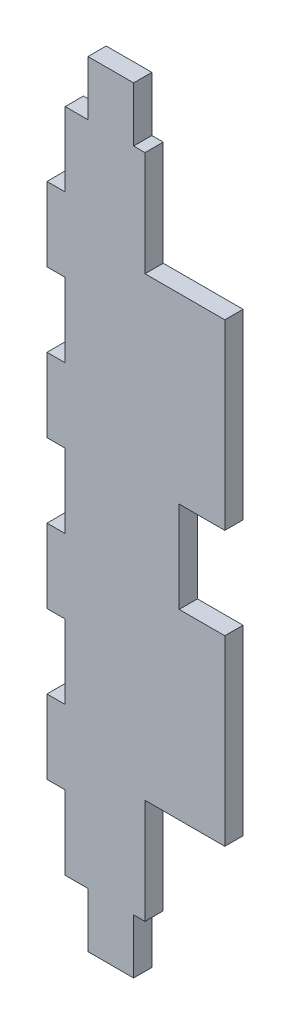
ISO-10303-21;
HEADER;
FILE_DESCRIPTION(('STEP AP214'),'2;1');
FILE_NAME('part.step','',(''),(''),'','','');
FILE_SCHEMA(('AUTOMOTIVE_DESIGN { 1 0 10303 214 1 1 1 1 }'));
ENDSEC;
DATA;
#1=APPLICATION_CONTEXT('core data for automotive mechanical design processes');
#2=APPLICATION_PROTOCOL_DEFINITION('international standard','automotive_design',2000,#1);
#3=PRODUCT_CONTEXT('',#1,'mechanical');
#4=PRODUCT('Part','Part','',(#3));
#5=PRODUCT_RELATED_PRODUCT_CATEGORY('part','',(#4));
#6=PRODUCT_DEFINITION_FORMATION('','',#4);
#7=PRODUCT_DEFINITION_CONTEXT('part definition',#1,'design');
#8=PRODUCT_DEFINITION('design','',#6,#7);
#9=PRODUCT_DEFINITION_SHAPE('','',#8);
#10=(LENGTH_UNIT() NAMED_UNIT(*) SI_UNIT(.MILLI.,.METRE.));
#11=(NAMED_UNIT(*) PLANE_ANGLE_UNIT() SI_UNIT($,.RADIAN.));
#12=(NAMED_UNIT(*) SI_UNIT($,.STERADIAN.) SOLID_ANGLE_UNIT());
#13=UNCERTAINTY_MEASURE_WITH_UNIT(LENGTH_MEASURE(1.E-05),#10,'distance_accuracy_value','');
#14=(GEOMETRIC_REPRESENTATION_CONTEXT(3) GLOBAL_UNCERTAINTY_ASSIGNED_CONTEXT((#13)) GLOBAL_UNIT_ASSIGNED_CONTEXT((#10,
#11,#12)) REPRESENTATION_CONTEXT('',''));
#15=CARTESIAN_POINT('',(0.,0.,0.));
#16=DIRECTION('',(0.,0.,1.));
#17=DIRECTION('',(1.,0.,0.));
#18=AXIS2_PLACEMENT_3D('',#15,#16,#17);
#19=CARTESIAN_POINT('',(44.45,-156.21,5.08));
#20=DIRECTION('',(-1.,0.,0.));
#21=DIRECTION('',(0.,0.,1.));
#22=AXIS2_PLACEMENT_3D('',#19,#20,#21);
#23=PLANE('',#22);
#24=DIRECTION('',(0.,0.,1.));
#25=VECTOR('',#24,1.);
#26=CARTESIAN_POINT('',(44.45,-80.01,5.08));
#27=LINE('',#26,#25);
#28=CARTESIAN_POINT('',(44.45,-80.01,0.));
#29=VERTEX_POINT('',#28);
#30=CARTESIAN_POINT('',(44.45,-80.01,5.08));
#31=VERTEX_POINT('',#30);
#32=EDGE_CURVE('E650',#29,#31,#27,.T.);
#33=ORIENTED_EDGE('',*,*,#32,.F.);
#34=DIRECTION('',(0.,1.,0.));
#35=VECTOR('',#34,1.);
#36=CARTESIAN_POINT('',(44.45,-156.21,0.));
#37=LINE('',#36,#35);
#38=CARTESIAN_POINT('',(44.45,-29.21,0.));
#39=VERTEX_POINT('',#38);
#40=EDGE_CURVE('E380',#29,#39,#37,.T.);
#41=ORIENTED_EDGE('',*,*,#40,.T.);
#42=DIRECTION('',(0.,0.,-1.));
#43=VECTOR('',#42,1.);
#44=CARTESIAN_POINT('',(44.45,-29.21,5.08));
#45=LINE('',#44,#43);
#46=CARTESIAN_POINT('',(44.45,-29.21,5.08));
#47=VERTEX_POINT('',#46);
#48=EDGE_CURVE('E416',#47,#39,#45,.T.);
#49=ORIENTED_EDGE('',*,*,#48,.F.);
#50=DIRECTION('',(0.,1.,0.));
#51=VECTOR('',#50,1.);
#52=CARTESIAN_POINT('',(44.45,-156.21,5.08));
#53=LINE('',#52,#51);
#54=EDGE_CURVE('E603',#31,#47,#53,.T.);
#55=ORIENTED_EDGE('',*,*,#54,.F.);
#56=EDGE_LOOP('',(#33,#41,#49,#55));
#57=FACE_BOUND('',#56,.T.);
#58=ADVANCED_FACE('F45',(#57),#23,.F.);
#59=CARTESIAN_POINT('',(6.34999999999998,0.,5.08));
#60=DIRECTION('',(0.,-1.,0.));
#61=DIRECTION('',(1.,0.,0.));
#62=AXIS2_PLACEMENT_3D('',#59,#60,#61);
#63=PLANE('',#62);
#64=DIRECTION('',(-1.,0.,0.));
#65=VECTOR('',#64,1.);
#66=CARTESIAN_POINT('',(6.34999999999998,0.,0.));
#67=LINE('',#66,#65);
#68=CARTESIAN_POINT('',(6.34999999999998,0.,0.));
#69=VERTEX_POINT('',#68);
#70=CARTESIAN_POINT('',(0.,0.,0.));
#71=VERTEX_POINT('',#70);
#72=EDGE_CURVE('E303',#69,#71,#67,.T.);
#73=ORIENTED_EDGE('',*,*,#72,.T.);
#74=DIRECTION('',(0.,0.,-1.));
#75=VECTOR('',#74,1.);
#76=CARTESIAN_POINT('',(0.,0.,5.08));
#77=LINE('',#76,#75);
#78=CARTESIAN_POINT('',(0.,0.,5.08));
#79=VERTEX_POINT('',#78);
#80=EDGE_CURVE('E11',#79,#71,#77,.T.);
#81=ORIENTED_EDGE('',*,*,#80,.F.);
#82=DIRECTION('',(-1.,0.,0.));
#83=VECTOR('',#82,1.);
#84=CARTESIAN_POINT('',(6.34999999999998,0.,5.08));
#85=LINE('',#84,#83);
#86=CARTESIAN_POINT('',(6.34999999999998,0.,5.08));
#87=VERTEX_POINT('',#86);
#88=EDGE_CURVE('E401',#87,#79,#85,.T.);
#89=ORIENTED_EDGE('',*,*,#88,.F.);
#90=DIRECTION('',(0.,0.,-1.));
#91=VECTOR('',#90,1.);
#92=CARTESIAN_POINT('',(6.34999999999998,0.,5.08));
#93=LINE('',#92,#91);
#94=EDGE_CURVE('E299',#87,#69,#93,.T.);
#95=ORIENTED_EDGE('',*,*,#94,.T.);
#96=EDGE_LOOP('',(#73,#81,#89,#95));
#97=FACE_BOUND('',#96,.T.);
#98=ADVANCED_FACE('F47',(#97),#63,.F.);
#99=CARTESIAN_POINT('',(0.,0.,5.08));
#100=DIRECTION('',(1.,0.,0.));
#101=DIRECTION('',(0.,0.,-1.));
#102=AXIS2_PLACEMENT_3D('',#99,#100,#101);
#103=PLANE('',#102);
#104=DIRECTION('',(0.,-1.,0.));
#105=VECTOR('',#104,1.);
#106=CARTESIAN_POINT('',(0.,0.,0.));
#107=LINE('',#106,#105);
#108=CARTESIAN_POINT('',(0.,-20.6022222222222,0.));
#109=VERTEX_POINT('',#108);
#110=EDGE_CURVE('E307',#71,#109,#107,.T.);
#111=ORIENTED_EDGE('',*,*,#110,.T.);
#112=DIRECTION('',(0.,0.,-1.));
#113=VECTOR('',#112,1.);
#114=CARTESIAN_POINT('',(0.,-20.6022222222222,5.08));
#115=LINE('',#114,#113);
#116=CARTESIAN_POINT('',(0.,-20.6022222222222,5.08));
#117=VERTEX_POINT('',#116);
#118=EDGE_CURVE('E54',#117,#109,#115,.T.);
#119=ORIENTED_EDGE('',*,*,#118,.F.);
#120=DIRECTION('',(0.,-1.,0.));
#121=VECTOR('',#120,1.);
#122=CARTESIAN_POINT('',(0.,0.,5.08));
#123=LINE('',#122,#121);
#124=EDGE_CURVE('E183',#79,#117,#123,.T.);
#125=ORIENTED_EDGE('',*,*,#124,.F.);
#126=ORIENTED_EDGE('',*,*,#80,.T.);
#127=EDGE_LOOP('',(#111,#119,#125,#126));
#128=FACE_BOUND('',#127,.T.);
#129=ADVANCED_FACE('F816',(#128),#103,.F.);
#130=CARTESIAN_POINT('',(0.,-20.6022222222222,5.08));
#131=DIRECTION('',(0.,-1.,0.));
#132=DIRECTION('',(1.,0.,0.));
#133=AXIS2_PLACEMENT_3D('',#130,#131,#132);
#134=PLANE('',#133);
#135=DIRECTION('',(-1.,0.,0.));
#136=VECTOR('',#135,1.);
#137=CARTESIAN_POINT('',(0.,-20.6022222222222,0.));
#138=LINE('',#137,#136);
#139=CARTESIAN_POINT('',(-5.08,-20.6022222222222,0.));
#140=VERTEX_POINT('',#139);
#141=EDGE_CURVE('E311',#109,#140,#138,.T.);
#142=ORIENTED_EDGE('',*,*,#141,.T.);
#143=DIRECTION('',(0.,0.,-1.));
#144=VECTOR('',#143,1.);
#145=CARTESIAN_POINT('',(-5.08,-20.6022222222222,5.08));
#146=LINE('',#145,#144);
#147=CARTESIAN_POINT('',(-5.08,-20.6022222222222,5.08));
#148=VERTEX_POINT('',#147);
#149=EDGE_CURVE('E508',#148,#140,#146,.T.);
#150=ORIENTED_EDGE('',*,*,#149,.F.);
#151=DIRECTION('',(-1.,0.,0.));
#152=VECTOR('',#151,1.);
#153=CARTESIAN_POINT('',(0.,-20.6022222222222,5.08));
#154=LINE('',#153,#152);
#155=EDGE_CURVE('E518',#117,#148,#154,.T.);
#156=ORIENTED_EDGE('',*,*,#155,.F.);
#157=ORIENTED_EDGE('',*,*,#118,.T.);
#158=EDGE_LOOP('',(#142,#150,#156,#157));
#159=FACE_BOUND('',#158,.T.);
#160=ADVANCED_FACE('F516',(#159),#134,.F.);
#161=CARTESIAN_POINT('',(-5.08,-20.6022222222222,5.08));
#162=DIRECTION('',(1.,0.,0.));
#163=DIRECTION('',(0.,0.,-1.));
#164=AXIS2_PLACEMENT_3D('',#161,#162,#163);
#165=PLANE('',#164);
#166=DIRECTION('',(0.,-1.,0.));
#167=VECTOR('',#166,1.);
#168=CARTESIAN_POINT('',(-5.08,-20.6022222222222,0.));
#169=LINE('',#168,#167);
#170=CARTESIAN_POINT('',(-5.08,-41.2044444444444,0.));
#171=VERTEX_POINT('',#170);
#172=EDGE_CURVE('E314',#140,#171,#169,.T.);
#173=ORIENTED_EDGE('',*,*,#172,.T.);
#174=DIRECTION('',(0.,0.,-1.));
#175=VECTOR('',#174,1.);
#176=CARTESIAN_POINT('',(-5.08,-41.2044444444444,5.08));
#177=LINE('',#176,#175);
#178=CARTESIAN_POINT('',(-5.08,-41.2044444444444,5.08));
#179=VERTEX_POINT('',#178);
#180=EDGE_CURVE('E504',#179,#171,#177,.T.);
#181=ORIENTED_EDGE('',*,*,#180,.F.);
#182=DIRECTION('',(0.,-1.,0.));
#183=VECTOR('',#182,1.);
#184=CARTESIAN_POINT('',(-5.08,-20.6022222222222,5.08));
#185=LINE('',#184,#183);
#186=EDGE_CURVE('E538',#148,#179,#185,.T.);
#187=ORIENTED_EDGE('',*,*,#186,.F.);
#188=ORIENTED_EDGE('',*,*,#149,.T.);
#189=EDGE_LOOP('',(#173,#181,#187,#188));
#190=FACE_BOUND('',#189,.T.);
#191=ADVANCED_FACE('F528',(#190),#165,.F.);
#192=CARTESIAN_POINT('',(-5.08,-41.2044444444444,5.08));
#193=DIRECTION('',(0.,1.,0.));
#194=DIRECTION('',(-1.,0.,0.));
#195=AXIS2_PLACEMENT_3D('',#192,#193,#194);
#196=PLANE('',#195);
#197=DIRECTION('',(1.,0.,0.));
#198=VECTOR('',#197,1.);
#199=CARTESIAN_POINT('',(-5.08,-41.2044444444444,0.));
#200=LINE('',#199,#198);
#201=CARTESIAN_POINT('',(0.,-41.2044444444445,0.));
#202=VERTEX_POINT('',#201);
#203=EDGE_CURVE('E317',#171,#202,#200,.T.);
#204=ORIENTED_EDGE('',*,*,#203,.T.);
#205=DIRECTION('',(0.,0.,-1.));
#206=VECTOR('',#205,1.);
#207=CARTESIAN_POINT('',(0.,-41.2044444444445,5.08));
#208=LINE('',#207,#206);
#209=CARTESIAN_POINT('',(0.,-41.2044444444445,5.08));
#210=VERTEX_POINT('',#209);
#211=EDGE_CURVE('E500',#210,#202,#208,.T.);
#212=ORIENTED_EDGE('',*,*,#211,.F.);
#213=DIRECTION('',(1.,0.,0.));
#214=VECTOR('',#213,1.);
#215=CARTESIAN_POINT('',(-5.08,-41.2044444444444,5.08));
#216=LINE('',#215,#214);
#217=EDGE_CURVE('E534',#179,#210,#216,.T.);
#218=ORIENTED_EDGE('',*,*,#217,.F.);
#219=ORIENTED_EDGE('',*,*,#180,.T.);
#220=EDGE_LOOP('',(#204,#212,#218,#219));
#221=FACE_BOUND('',#220,.T.);
#222=ADVANCED_FACE('F532',(#221),#196,.F.);
#223=CARTESIAN_POINT('',(0.,-41.2044444444445,5.08));
#224=DIRECTION('',(1.,0.,0.));
#225=DIRECTION('',(0.,0.,-1.));
#226=AXIS2_PLACEMENT_3D('',#223,#224,#225);
#227=PLANE('',#226);
#228=DIRECTION('',(0.,-1.,0.));
#229=VECTOR('',#228,1.);
#230=CARTESIAN_POINT('',(0.,-41.2044444444445,0.));
#231=LINE('',#230,#229);
#232=CARTESIAN_POINT('',(0.,-61.8066666666667,0.));
#233=VERTEX_POINT('',#232);
#234=EDGE_CURVE('E320',#202,#233,#231,.T.);
#235=ORIENTED_EDGE('',*,*,#234,.T.);
#236=DIRECTION('',(0.,0.,-1.));
#237=VECTOR('',#236,1.);
#238=CARTESIAN_POINT('',(0.,-61.8066666666667,5.08));
#239=LINE('',#238,#237);
#240=CARTESIAN_POINT('',(0.,-61.8066666666667,5.08));
#241=VERTEX_POINT('',#240);
#242=EDGE_CURVE('E496',#241,#233,#239,.T.);
#243=ORIENTED_EDGE('',*,*,#242,.F.);
#244=DIRECTION('',(0.,-1.,0.));
#245=VECTOR('',#244,1.);
#246=CARTESIAN_POINT('',(0.,-41.2044444444445,5.08));
#247=LINE('',#246,#245);
#248=EDGE_CURVE('E537',#210,#241,#247,.T.);
#249=ORIENTED_EDGE('',*,*,#248,.F.);
#250=ORIENTED_EDGE('',*,*,#211,.T.);
#251=EDGE_LOOP('',(#235,#243,#249,#250));
#252=FACE_BOUND('',#251,.T.);
#253=ADVANCED_FACE('F785',(#252),#227,.F.);
#254=CARTESIAN_POINT('',(0.,-61.8066666666667,5.08));
#255=DIRECTION('',(0.,-1.,0.));
#256=DIRECTION('',(1.,0.,0.));
#257=AXIS2_PLACEMENT_3D('',#254,#255,#256);
#258=PLANE('',#257);
#259=DIRECTION('',(-1.,0.,0.));
#260=VECTOR('',#259,1.);
#261=CARTESIAN_POINT('',(0.,-61.8066666666667,0.));
#262=LINE('',#261,#260);
#263=CARTESIAN_POINT('',(-5.08,-61.8066666666667,0.));
#264=VERTEX_POINT('',#263);
#265=EDGE_CURVE('E323',#233,#264,#262,.T.);
#266=ORIENTED_EDGE('',*,*,#265,.T.);
#267=DIRECTION('',(0.,0.,-1.));
#268=VECTOR('',#267,1.);
#269=CARTESIAN_POINT('',(-5.08,-61.8066666666667,5.08));
#270=LINE('',#269,#268);
#271=CARTESIAN_POINT('',(-5.08,-61.8066666666667,5.08));
#272=VERTEX_POINT('',#271);
#273=EDGE_CURVE('E492',#272,#264,#270,.T.);
#274=ORIENTED_EDGE('',*,*,#273,.F.);
#275=DIRECTION('',(-1.,0.,0.));
#276=VECTOR('',#275,1.);
#277=CARTESIAN_POINT('',(0.,-61.8066666666667,5.08));
#278=LINE('',#277,#276);
#279=EDGE_CURVE('E542',#241,#272,#278,.T.);
#280=ORIENTED_EDGE('',*,*,#279,.F.);
#281=ORIENTED_EDGE('',*,*,#242,.T.);
#282=EDGE_LOOP('',(#266,#274,#280,#281));
#283=FACE_BOUND('',#282,.T.);
#284=ADVANCED_FACE('F782',(#283),#258,.F.);
#285=CARTESIAN_POINT('',(-5.08,-61.8066666666667,5.08));
#286=DIRECTION('',(1.,0.,0.));
#287=DIRECTION('',(0.,0.,-1.));
#288=AXIS2_PLACEMENT_3D('',#285,#286,#287);
#289=PLANE('',#288);
#290=DIRECTION('',(0.,-1.,0.));
#291=VECTOR('',#290,1.);
#292=CARTESIAN_POINT('',(-5.08,-61.8066666666667,0.));
#293=LINE('',#292,#291);
#294=CARTESIAN_POINT('',(-5.08,-82.4088888888889,0.));
#295=VERTEX_POINT('',#294);
#296=EDGE_CURVE('E326',#264,#295,#293,.T.);
#297=ORIENTED_EDGE('',*,*,#296,.T.);
#298=DIRECTION('',(0.,0.,-1.));
#299=VECTOR('',#298,1.);
#300=CARTESIAN_POINT('',(-5.08,-82.4088888888889,5.08));
#301=LINE('',#300,#299);
#302=CARTESIAN_POINT('',(-5.08,-82.4088888888889,5.08));
#303=VERTEX_POINT('',#302);
#304=EDGE_CURVE('E488',#303,#295,#301,.T.);
#305=ORIENTED_EDGE('',*,*,#304,.F.);
#306=DIRECTION('',(0.,-1.,0.));
#307=VECTOR('',#306,1.);
#308=CARTESIAN_POINT('',(-5.08,-61.8066666666667,5.08));
#309=LINE('',#308,#307);
#310=EDGE_CURVE('E549',#272,#303,#309,.T.);
#311=ORIENTED_EDGE('',*,*,#310,.F.);
#312=ORIENTED_EDGE('',*,*,#273,.T.);
#313=EDGE_LOOP('',(#297,#305,#311,#312));
#314=FACE_BOUND('',#313,.T.);
#315=ADVANCED_FACE('F778',(#314),#289,.F.);
#316=CARTESIAN_POINT('',(-5.08,-82.4088888888889,5.08));
#317=DIRECTION('',(0.,1.,0.));
#318=DIRECTION('',(-1.,0.,0.));
#319=AXIS2_PLACEMENT_3D('',#316,#317,#318);
#320=PLANE('',#319);
#321=DIRECTION('',(1.,0.,0.));
#322=VECTOR('',#321,1.);
#323=CARTESIAN_POINT('',(-5.08,-82.4088888888889,0.));
#324=LINE('',#323,#322);
#325=CARTESIAN_POINT('',(0.,-82.4088888888889,0.));
#326=VERTEX_POINT('',#325);
#327=EDGE_CURVE('E329',#295,#326,#324,.T.);
#328=ORIENTED_EDGE('',*,*,#327,.T.);
#329=DIRECTION('',(0.,0.,-1.));
#330=VECTOR('',#329,1.);
#331=CARTESIAN_POINT('',(0.,-82.4088888888889,5.08));
#332=LINE('',#331,#330);
#333=CARTESIAN_POINT('',(0.,-82.4088888888889,5.08));
#334=VERTEX_POINT('',#333);
#335=EDGE_CURVE('E484',#334,#326,#332,.T.);
#336=ORIENTED_EDGE('',*,*,#335,.F.);
#337=DIRECTION('',(1.,0.,0.));
#338=VECTOR('',#337,1.);
#339=CARTESIAN_POINT('',(-5.08,-82.4088888888889,5.08));
#340=LINE('',#339,#338);
#341=EDGE_CURVE('E552',#303,#334,#340,.T.);
#342=ORIENTED_EDGE('',*,*,#341,.F.);
#343=ORIENTED_EDGE('',*,*,#304,.T.);
#344=EDGE_LOOP('',(#328,#336,#342,#343));
#345=FACE_BOUND('',#344,.T.);
#346=ADVANCED_FACE('F773',(#345),#320,.F.);
#347=CARTESIAN_POINT('',(0.,-82.4088888888889,5.08));
#348=DIRECTION('',(1.,0.,0.));
#349=DIRECTION('',(0.,0.,-1.));
#350=AXIS2_PLACEMENT_3D('',#347,#348,#349);
#351=PLANE('',#350);
#352=DIRECTION('',(0.,-1.,0.));
#353=VECTOR('',#352,1.);
#354=CARTESIAN_POINT('',(0.,-82.4088888888889,0.));
#355=LINE('',#354,#353);
#356=CARTESIAN_POINT('',(0.,-103.011111111111,0.));
#357=VERTEX_POINT('',#356);
#358=EDGE_CURVE('E332',#326,#357,#355,.T.);
#359=ORIENTED_EDGE('',*,*,#358,.T.);
#360=DIRECTION('',(0.,0.,-1.));
#361=VECTOR('',#360,1.);
#362=CARTESIAN_POINT('',(0.,-103.011111111111,5.08));
#363=LINE('',#362,#361);
#364=CARTESIAN_POINT('',(0.,-103.011111111111,5.08));
#365=VERTEX_POINT('',#364);
#366=EDGE_CURVE('E480',#365,#357,#363,.T.);
#367=ORIENTED_EDGE('',*,*,#366,.F.);
#368=DIRECTION('',(0.,-1.,0.));
#369=VECTOR('',#368,1.);
#370=CARTESIAN_POINT('',(0.,-82.4088888888889,5.08));
#371=LINE('',#370,#369);
#372=EDGE_CURVE('E555',#334,#365,#371,.T.);
#373=ORIENTED_EDGE('',*,*,#372,.F.);
#374=ORIENTED_EDGE('',*,*,#335,.T.);
#375=EDGE_LOOP('',(#359,#367,#373,#374));
#376=FACE_BOUND('',#375,.T.);
#377=ADVANCED_FACE('F767',(#376),#351,.F.);
#378=CARTESIAN_POINT('',(0.,-103.011111111111,5.08));
#379=DIRECTION('',(0.,-1.,0.));
#380=DIRECTION('',(1.,0.,0.));
#381=AXIS2_PLACEMENT_3D('',#378,#379,#380);
#382=PLANE('',#381);
#383=DIRECTION('',(-1.,0.,0.));
#384=VECTOR('',#383,1.);
#385=CARTESIAN_POINT('',(0.,-103.011111111111,0.));
#386=LINE('',#385,#384);
#387=CARTESIAN_POINT('',(-5.08,-103.011111111111,0.));
#388=VERTEX_POINT('',#387);
#389=EDGE_CURVE('E335',#357,#388,#386,.T.);
#390=ORIENTED_EDGE('',*,*,#389,.T.);
#391=DIRECTION('',(0.,0.,-1.));
#392=VECTOR('',#391,1.);
#393=CARTESIAN_POINT('',(-5.08,-103.011111111111,5.08));
#394=LINE('',#393,#392);
#395=CARTESIAN_POINT('',(-5.08,-103.011111111111,5.08));
#396=VERTEX_POINT('',#395);
#397=EDGE_CURVE('E476',#396,#388,#394,.T.);
#398=ORIENTED_EDGE('',*,*,#397,.F.);
#399=DIRECTION('',(-1.,0.,0.));
#400=VECTOR('',#399,1.);
#401=CARTESIAN_POINT('',(0.,-103.011111111111,5.08));
#402=LINE('',#401,#400);
#403=EDGE_CURVE('E558',#365,#396,#402,.T.);
#404=ORIENTED_EDGE('',*,*,#403,.F.);
#405=ORIENTED_EDGE('',*,*,#366,.T.);
#406=EDGE_LOOP('',(#390,#398,#404,#405));
#407=FACE_BOUND('',#406,.T.);
#408=ADVANCED_FACE('F763',(#407),#382,.F.);
#409=CARTESIAN_POINT('',(-5.08,-103.011111111111,5.08));
#410=DIRECTION('',(1.,0.,0.));
#411=DIRECTION('',(0.,0.,-1.));
#412=AXIS2_PLACEMENT_3D('',#409,#410,#411);
#413=PLANE('',#412);
#414=DIRECTION('',(0.,-1.,0.));
#415=VECTOR('',#414,1.);
#416=CARTESIAN_POINT('',(-5.08,-103.011111111111,0.));
#417=LINE('',#416,#415);
#418=CARTESIAN_POINT('',(-5.08,-123.613333333333,0.));
#419=VERTEX_POINT('',#418);
#420=EDGE_CURVE('E338',#388,#419,#417,.T.);
#421=ORIENTED_EDGE('',*,*,#420,.T.);
#422=DIRECTION('',(0.,0.,-1.));
#423=VECTOR('',#422,1.);
#424=CARTESIAN_POINT('',(-5.08,-123.613333333333,5.08));
#425=LINE('',#424,#423);
#426=CARTESIAN_POINT('',(-5.08,-123.613333333333,5.08));
#427=VERTEX_POINT('',#426);
#428=EDGE_CURVE('E472',#427,#419,#425,.T.);
#429=ORIENTED_EDGE('',*,*,#428,.F.);
#430=DIRECTION('',(0.,-1.,0.));
#431=VECTOR('',#430,1.);
#432=CARTESIAN_POINT('',(-5.08,-103.011111111111,5.08));
#433=LINE('',#432,#431);
#434=EDGE_CURVE('E561',#396,#427,#433,.T.);
#435=ORIENTED_EDGE('',*,*,#434,.F.);
#436=ORIENTED_EDGE('',*,*,#397,.T.);
#437=EDGE_LOOP('',(#421,#429,#435,#436));
#438=FACE_BOUND('',#437,.T.);
#439=ADVANCED_FACE('F758',(#438),#413,.F.);
#440=CARTESIAN_POINT('',(-5.08,-123.613333333333,5.08));
#441=DIRECTION('',(0.,1.,0.));
#442=DIRECTION('',(-1.,0.,0.));
#443=AXIS2_PLACEMENT_3D('',#440,#441,#442);
#444=PLANE('',#443);
#445=DIRECTION('',(1.,0.,0.));
#446=VECTOR('',#445,1.);
#447=CARTESIAN_POINT('',(-5.08,-123.613333333333,0.));
#448=LINE('',#447,#446);
#449=CARTESIAN_POINT('',(0.,-123.613333333333,0.));
#450=VERTEX_POINT('',#449);
#451=EDGE_CURVE('E341',#419,#450,#448,.T.);
#452=ORIENTED_EDGE('',*,*,#451,.T.);
#453=DIRECTION('',(0.,0.,-1.));
#454=VECTOR('',#453,1.);
#455=CARTESIAN_POINT('',(0.,-123.613333333333,5.08));
#456=LINE('',#455,#454);
#457=CARTESIAN_POINT('',(0.,-123.613333333333,5.08));
#458=VERTEX_POINT('',#457);
#459=EDGE_CURVE('E468',#458,#450,#456,.T.);
#460=ORIENTED_EDGE('',*,*,#459,.F.);
#461=DIRECTION('',(1.,0.,0.));
#462=VECTOR('',#461,1.);
#463=CARTESIAN_POINT('',(-5.08,-123.613333333333,5.08));
#464=LINE('',#463,#462);
#465=EDGE_CURVE('E564',#427,#458,#464,.T.);
#466=ORIENTED_EDGE('',*,*,#465,.F.);
#467=ORIENTED_EDGE('',*,*,#428,.T.);
#468=EDGE_LOOP('',(#452,#460,#466,#467));
#469=FACE_BOUND('',#468,.T.);
#470=ADVANCED_FACE('F752',(#469),#444,.F.);
#471=CARTESIAN_POINT('',(0.,-123.613333333333,5.08));
#472=DIRECTION('',(1.,0.,0.));
#473=DIRECTION('',(0.,0.,-1.));
#474=AXIS2_PLACEMENT_3D('',#471,#472,#473);
#475=PLANE('',#474);
#476=DIRECTION('',(0.,-1.,0.));
#477=VECTOR('',#476,1.);
#478=CARTESIAN_POINT('',(0.,-123.613333333333,0.));
#479=LINE('',#478,#477);
#480=CARTESIAN_POINT('',(0.,-144.215555555556,0.));
#481=VERTEX_POINT('',#480);
#482=EDGE_CURVE('E344',#450,#481,#479,.T.);
#483=ORIENTED_EDGE('',*,*,#482,.T.);
#484=DIRECTION('',(0.,0.,-1.));
#485=VECTOR('',#484,1.);
#486=CARTESIAN_POINT('',(0.,-144.215555555556,5.08));
#487=LINE('',#486,#485);
#488=CARTESIAN_POINT('',(0.,-144.215555555556,5.08));
#489=VERTEX_POINT('',#488);
#490=EDGE_CURVE('E464',#489,#481,#487,.T.);
#491=ORIENTED_EDGE('',*,*,#490,.F.);
#492=DIRECTION('',(0.,-1.,0.));
#493=VECTOR('',#492,1.);
#494=CARTESIAN_POINT('',(0.,-123.613333333333,5.08));
#495=LINE('',#494,#493);
#496=EDGE_CURVE('E567',#458,#489,#495,.T.);
#497=ORIENTED_EDGE('',*,*,#496,.F.);
#498=ORIENTED_EDGE('',*,*,#459,.T.);
#499=EDGE_LOOP('',(#483,#491,#497,#498));
#500=FACE_BOUND('',#499,.T.);
#501=ADVANCED_FACE('F748',(#500),#475,.F.);
#502=CARTESIAN_POINT('',(0.,-144.215555555556,5.08));
#503=DIRECTION('',(0.,-1.,0.));
#504=DIRECTION('',(0.,0.,-1.));
#505=AXIS2_PLACEMENT_3D('',#502,#503,#504);
#506=PLANE('',#505);
#507=DIRECTION('',(-1.,0.,0.));
#508=VECTOR('',#507,1.);
#509=CARTESIAN_POINT('',(0.,-144.215555555556,0.));
#510=LINE('',#509,#508);
#511=CARTESIAN_POINT('',(-5.08,-144.215555555556,0.));
#512=VERTEX_POINT('',#511);
#513=EDGE_CURVE('E347',#481,#512,#510,.T.);
#514=ORIENTED_EDGE('',*,*,#513,.T.);
#515=DIRECTION('',(0.,0.,-1.));
#516=VECTOR('',#515,1.);
#517=CARTESIAN_POINT('',(-5.08,-144.215555555556,5.08));
#518=LINE('',#517,#516);
#519=CARTESIAN_POINT('',(-5.08,-144.215555555556,5.08));
#520=VERTEX_POINT('',#519);
#521=EDGE_CURVE('E460',#520,#512,#518,.T.);
#522=ORIENTED_EDGE('',*,*,#521,.F.);
#523=DIRECTION('',(-1.,0.,0.));
#524=VECTOR('',#523,1.);
#525=CARTESIAN_POINT('',(0.,-144.215555555556,5.08));
#526=LINE('',#525,#524);
#527=EDGE_CURVE('E570',#489,#520,#526,.T.);
#528=ORIENTED_EDGE('',*,*,#527,.F.);
#529=ORIENTED_EDGE('',*,*,#490,.T.);
#530=EDGE_LOOP('',(#514,#522,#528,#529));
#531=FACE_BOUND('',#530,.T.);
#532=ADVANCED_FACE('F743',(#531),#506,.F.);
#533=CARTESIAN_POINT('',(-5.08,-144.215555555556,5.08));
#534=DIRECTION('',(1.,0.,0.));
#535=DIRECTION('',(0.,0.,-1.));
#536=AXIS2_PLACEMENT_3D('',#533,#534,#535);
#537=PLANE('',#536);
#538=DIRECTION('',(0.,-1.,0.));
#539=VECTOR('',#538,1.);
#540=CARTESIAN_POINT('',(-5.08,-144.215555555556,0.));
#541=LINE('',#540,#539);
#542=CARTESIAN_POINT('',(-5.08,-164.817777777778,0.));
#543=VERTEX_POINT('',#542);
#544=EDGE_CURVE('E350',#512,#543,#541,.T.);
#545=ORIENTED_EDGE('',*,*,#544,.T.);
#546=DIRECTION('',(0.,0.,-1.));
#547=VECTOR('',#546,1.);
#548=CARTESIAN_POINT('',(-5.08,-164.817777777778,5.08));
#549=LINE('',#548,#547);
#550=CARTESIAN_POINT('',(-5.08,-164.817777777778,5.08));
#551=VERTEX_POINT('',#550);
#552=EDGE_CURVE('E456',#551,#543,#549,.T.);
#553=ORIENTED_EDGE('',*,*,#552,.F.);
#554=DIRECTION('',(0.,-1.,0.));
#555=VECTOR('',#554,1.);
#556=CARTESIAN_POINT('',(-5.08,-144.215555555556,5.08));
#557=LINE('',#556,#555);
#558=EDGE_CURVE('E573',#520,#551,#557,.T.);
#559=ORIENTED_EDGE('',*,*,#558,.F.);
#560=ORIENTED_EDGE('',*,*,#521,.T.);
#561=EDGE_LOOP('',(#545,#553,#559,#560));
#562=FACE_BOUND('',#561,.T.);
#563=ADVANCED_FACE('F737',(#562),#537,.F.);
#564=CARTESIAN_POINT('',(-5.08,-164.817777777778,5.08));
#565=DIRECTION('',(0.,1.,0.));
#566=DIRECTION('',(0.,0.,1.));
#567=AXIS2_PLACEMENT_3D('',#564,#565,#566);
#568=PLANE('',#567);
#569=DIRECTION('',(1.,0.,0.));
#570=VECTOR('',#569,1.);
#571=CARTESIAN_POINT('',(-5.08,-164.817777777778,0.));
#572=LINE('',#571,#570);
#573=CARTESIAN_POINT('',(0.,-164.817777777778,0.));
#574=VERTEX_POINT('',#573);
#575=EDGE_CURVE('E353',#543,#574,#572,.T.);
#576=ORIENTED_EDGE('',*,*,#575,.T.);
#577=DIRECTION('',(0.,0.,-1.));
#578=VECTOR('',#577,1.);
#579=CARTESIAN_POINT('',(0.,-164.817777777778,5.08));
#580=LINE('',#579,#578);
#581=CARTESIAN_POINT('',(0.,-164.817777777778,5.08));
#582=VERTEX_POINT('',#581);
#583=EDGE_CURVE('E452',#582,#574,#580,.T.);
#584=ORIENTED_EDGE('',*,*,#583,.F.);
#585=DIRECTION('',(1.,0.,0.));
#586=VECTOR('',#585,1.);
#587=CARTESIAN_POINT('',(-5.08,-164.817777777778,5.08));
#588=LINE('',#587,#586);
#589=EDGE_CURVE('E576',#551,#582,#588,.T.);
#590=ORIENTED_EDGE('',*,*,#589,.F.);
#591=ORIENTED_EDGE('',*,*,#552,.T.);
#592=EDGE_LOOP('',(#576,#584,#590,#591));
#593=FACE_BOUND('',#592,.T.);
#594=ADVANCED_FACE('F733',(#593),#568,.F.);
#595=CARTESIAN_POINT('',(0.,-164.817777777778,5.08));
#596=DIRECTION('',(1.,0.,0.));
#597=DIRECTION('',(0.,0.,-1.));
#598=AXIS2_PLACEMENT_3D('',#595,#596,#597);
#599=PLANE('',#598);
#600=DIRECTION('',(0.,-1.,0.));
#601=VECTOR('',#600,1.);
#602=CARTESIAN_POINT('',(0.,-164.817777777778,0.));
#603=LINE('',#602,#601);
#604=CARTESIAN_POINT('',(0.,-185.42,0.));
#605=VERTEX_POINT('',#604);
#606=EDGE_CURVE('E356',#574,#605,#603,.T.);
#607=ORIENTED_EDGE('',*,*,#606,.T.);
#608=DIRECTION('',(0.,0.,-1.));
#609=VECTOR('',#608,1.);
#610=CARTESIAN_POINT('',(0.,-185.42,5.08));
#611=LINE('',#610,#609);
#612=CARTESIAN_POINT('',(0.,-185.42,5.08));
#613=VERTEX_POINT('',#612);
#614=EDGE_CURVE('E448',#613,#605,#611,.T.);
#615=ORIENTED_EDGE('',*,*,#614,.F.);
#616=DIRECTION('',(0.,-1.,0.));
#617=VECTOR('',#616,1.);
#618=CARTESIAN_POINT('',(0.,-164.817777777778,5.08));
#619=LINE('',#618,#617);
#620=EDGE_CURVE('E579',#582,#613,#619,.T.);
#621=ORIENTED_EDGE('',*,*,#620,.F.);
#622=ORIENTED_EDGE('',*,*,#583,.T.);
#623=EDGE_LOOP('',(#607,#615,#621,#622));
#624=FACE_BOUND('',#623,.T.);
#625=ADVANCED_FACE('F728',(#624),#599,.F.);
#626=CARTESIAN_POINT('',(0.,-185.42,5.08));
#627=DIRECTION('',(0.,1.,0.));
#628=DIRECTION('',(0.,0.,1.));
#629=AXIS2_PLACEMENT_3D('',#626,#627,#628);
#630=PLANE('',#629);
#631=DIRECTION('',(1.,0.,0.));
#632=VECTOR('',#631,1.);
#633=CARTESIAN_POINT('',(0.,-185.42,0.));
#634=LINE('',#633,#632);
#635=CARTESIAN_POINT('',(6.35,-185.42,0.));
#636=VERTEX_POINT('',#635);
#637=EDGE_CURVE('E359',#605,#636,#634,.T.);
#638=ORIENTED_EDGE('',*,*,#637,.T.);
#639=DIRECTION('',(0.,0.,-1.));
#640=VECTOR('',#639,1.);
#641=CARTESIAN_POINT('',(6.35,-185.42,5.08));
#642=LINE('',#641,#640);
#643=CARTESIAN_POINT('',(6.35,-185.42,5.08));
#644=VERTEX_POINT('',#643);
#645=EDGE_CURVE('E444',#644,#636,#642,.T.);
#646=ORIENTED_EDGE('',*,*,#645,.F.);
#647=DIRECTION('',(1.,0.,0.));
#648=VECTOR('',#647,1.);
#649=CARTESIAN_POINT('',(0.,-185.42,5.08));
#650=LINE('',#649,#648);
#651=EDGE_CURVE('E582',#613,#644,#650,.T.);
#652=ORIENTED_EDGE('',*,*,#651,.F.);
#653=ORIENTED_EDGE('',*,*,#614,.T.);
#654=EDGE_LOOP('',(#638,#646,#652,#653));
#655=FACE_BOUND('',#654,.T.);
#656=ADVANCED_FACE('F722',(#655),#630,.F.);
#657=CARTESIAN_POINT('',(6.35,-185.42,5.08));
#658=DIRECTION('',(1.,0.,0.));
#659=DIRECTION('',(0.,1.,0.));
#660=AXIS2_PLACEMENT_3D('',#657,#658,#659);
#661=PLANE('',#660);
#662=DIRECTION('',(0.,-1.,0.));
#663=VECTOR('',#662,1.);
#664=CARTESIAN_POINT('',(6.35,-185.42,0.));
#665=LINE('',#664,#663);
#666=CARTESIAN_POINT('',(6.35000000000002,-200.66,0.));
#667=VERTEX_POINT('',#666);
#668=EDGE_CURVE('E362',#636,#667,#665,.T.);
#669=ORIENTED_EDGE('',*,*,#668,.T.);
#670=DIRECTION('',(0.,0.,-1.));
#671=VECTOR('',#670,1.);
#672=CARTESIAN_POINT('',(6.35000000000002,-200.66,5.08));
#673=LINE('',#672,#671);
#674=CARTESIAN_POINT('',(6.35000000000002,-200.66,5.08));
#675=VERTEX_POINT('',#674);
#676=EDGE_CURVE('E440',#675,#667,#673,.T.);
#677=ORIENTED_EDGE('',*,*,#676,.F.);
#678=DIRECTION('',(0.,-1.,0.));
#679=VECTOR('',#678,1.);
#680=CARTESIAN_POINT('',(6.35,-185.42,5.08));
#681=LINE('',#680,#679);
#682=EDGE_CURVE('E585',#644,#675,#681,.T.);
#683=ORIENTED_EDGE('',*,*,#682,.F.);
#684=ORIENTED_EDGE('',*,*,#645,.T.);
#685=EDGE_LOOP('',(#669,#677,#683,#684));
#686=FACE_BOUND('',#685,.T.);
#687=ADVANCED_FACE('F718',(#686),#661,.F.);
#688=CARTESIAN_POINT('',(6.35000000000002,-200.66,5.08));
#689=DIRECTION('',(0.,1.,0.));
#690=DIRECTION('',(0.,0.,1.));
#691=AXIS2_PLACEMENT_3D('',#688,#689,#690);
#692=PLANE('',#691);
#693=DIRECTION('',(1.,0.,0.));
#694=VECTOR('',#693,1.);
#695=CARTESIAN_POINT('',(6.35000000000002,-200.66,0.));
#696=LINE('',#695,#694);
#697=CARTESIAN_POINT('',(19.05,-200.66,0.));
#698=VERTEX_POINT('',#697);
#699=EDGE_CURVE('E365',#667,#698,#696,.T.);
#700=ORIENTED_EDGE('',*,*,#699,.T.);
#701=DIRECTION('',(0.,0.,-1.));
#702=VECTOR('',#701,1.);
#703=CARTESIAN_POINT('',(19.05,-200.66,5.08));
#704=LINE('',#703,#702);
#705=CARTESIAN_POINT('',(19.05,-200.66,5.08));
#706=VERTEX_POINT('',#705);
#707=EDGE_CURVE('E436',#706,#698,#704,.T.);
#708=ORIENTED_EDGE('',*,*,#707,.F.);
#709=DIRECTION('',(1.,0.,0.));
#710=VECTOR('',#709,1.);
#711=CARTESIAN_POINT('',(6.35000000000002,-200.66,5.08));
#712=LINE('',#711,#710);
#713=EDGE_CURVE('E588',#675,#706,#712,.T.);
#714=ORIENTED_EDGE('',*,*,#713,.F.);
#715=ORIENTED_EDGE('',*,*,#676,.T.);
#716=EDGE_LOOP('',(#700,#708,#714,#715));
#717=FACE_BOUND('',#716,.T.);
#718=ADVANCED_FACE('F713',(#717),#692,.F.);
#719=CARTESIAN_POINT('',(19.05,-200.66,5.08));
#720=DIRECTION('',(-1.,0.,0.));
#721=DIRECTION('',(0.,0.,1.));
#722=AXIS2_PLACEMENT_3D('',#719,#720,#721);
#723=PLANE('',#722);
#724=DIRECTION('',(0.,1.,0.));
#725=VECTOR('',#724,1.);
#726=CARTESIAN_POINT('',(19.05,-200.66,0.));
#727=LINE('',#726,#725);
#728=CARTESIAN_POINT('',(19.05,-185.42,0.));
#729=VERTEX_POINT('',#728);
#730=EDGE_CURVE('E368',#698,#729,#727,.T.);
#731=ORIENTED_EDGE('',*,*,#730,.T.);
#732=DIRECTION('',(0.,0.,-1.));
#733=VECTOR('',#732,1.);
#734=CARTESIAN_POINT('',(19.05,-185.42,5.08));
#735=LINE('',#734,#733);
#736=CARTESIAN_POINT('',(19.05,-185.42,5.08));
#737=VERTEX_POINT('',#736);
#738=EDGE_CURVE('E432',#737,#729,#735,.T.);
#739=ORIENTED_EDGE('',*,*,#738,.F.);
#740=DIRECTION('',(0.,1.,0.));
#741=VECTOR('',#740,1.);
#742=CARTESIAN_POINT('',(19.05,-200.66,5.08));
#743=LINE('',#742,#741);
#744=EDGE_CURVE('E591',#706,#737,#743,.T.);
#745=ORIENTED_EDGE('',*,*,#744,.F.);
#746=ORIENTED_EDGE('',*,*,#707,.T.);
#747=EDGE_LOOP('',(#731,#739,#745,#746));
#748=FACE_BOUND('',#747,.T.);
#749=ADVANCED_FACE('F707',(#748),#723,.F.);
#750=CARTESIAN_POINT('',(19.05,-185.42,5.08));
#751=DIRECTION('',(0.,1.,0.));
#752=DIRECTION('',(0.,0.,1.));
#753=AXIS2_PLACEMENT_3D('',#750,#751,#752);
#754=PLANE('',#753);
#755=DIRECTION('',(1.,0.,0.));
#756=VECTOR('',#755,1.);
#757=CARTESIAN_POINT('',(19.05,-185.42,0.));
#758=LINE('',#757,#756);
#759=CARTESIAN_POINT('',(22.225,-185.42,0.));
#760=VERTEX_POINT('',#759);
#761=EDGE_CURVE('E371',#729,#760,#758,.T.);
#762=ORIENTED_EDGE('',*,*,#761,.T.);
#763=DIRECTION('',(0.,0.,-1.));
#764=VECTOR('',#763,1.);
#765=CARTESIAN_POINT('',(22.225,-185.42,5.08));
#766=LINE('',#765,#764);
#767=CARTESIAN_POINT('',(22.225,-185.42,5.08));
#768=VERTEX_POINT('',#767);
#769=EDGE_CURVE('E428',#768,#760,#766,.T.);
#770=ORIENTED_EDGE('',*,*,#769,.F.);
#771=DIRECTION('',(1.,0.,0.));
#772=VECTOR('',#771,1.);
#773=CARTESIAN_POINT('',(19.05,-185.42,5.08));
#774=LINE('',#773,#772);
#775=EDGE_CURVE('E594',#737,#768,#774,.T.);
#776=ORIENTED_EDGE('',*,*,#775,.F.);
#777=ORIENTED_EDGE('',*,*,#738,.T.);
#778=EDGE_LOOP('',(#762,#770,#776,#777));
#779=FACE_BOUND('',#778,.T.);
#780=ADVANCED_FACE('F703',(#779),#754,.F.);
#781=CARTESIAN_POINT('',(22.225,-185.42,5.08));
#782=DIRECTION('',(-1.,0.,0.));
#783=DIRECTION('',(0.,0.,1.));
#784=AXIS2_PLACEMENT_3D('',#781,#782,#783);
#785=PLANE('',#784);
#786=DIRECTION('',(0.,1.,0.));
#787=VECTOR('',#786,1.);
#788=CARTESIAN_POINT('',(22.225,-185.42,0.));
#789=LINE('',#788,#787);
#790=CARTESIAN_POINT('',(22.225,-156.21,0.));
#791=VERTEX_POINT('',#790);
#792=EDGE_CURVE('E374',#760,#791,#789,.T.);
#793=ORIENTED_EDGE('',*,*,#792,.T.);
#794=DIRECTION('',(0.,0.,-1.));
#795=VECTOR('',#794,1.);
#796=CARTESIAN_POINT('',(22.225,-156.21,5.08));
#797=LINE('',#796,#795);
#798=CARTESIAN_POINT('',(22.225,-156.21,5.08));
#799=VERTEX_POINT('',#798);
#800=EDGE_CURVE('E424',#799,#791,#797,.T.);
#801=ORIENTED_EDGE('',*,*,#800,.F.);
#802=DIRECTION('',(0.,1.,0.));
#803=VECTOR('',#802,1.);
#804=CARTESIAN_POINT('',(22.225,-185.42,5.08));
#805=LINE('',#804,#803);
#806=EDGE_CURVE('E597',#768,#799,#805,.T.);
#807=ORIENTED_EDGE('',*,*,#806,.F.);
#808=ORIENTED_EDGE('',*,*,#769,.T.);
#809=EDGE_LOOP('',(#793,#801,#807,#808));
#810=FACE_BOUND('',#809,.T.);
#811=ADVANCED_FACE('F698',(#810),#785,.F.);
#812=CARTESIAN_POINT('',(22.225,-156.21,5.08));
#813=DIRECTION('',(0.,1.,0.));
#814=DIRECTION('',(0.,0.,1.));
#815=AXIS2_PLACEMENT_3D('',#812,#813,#814);
#816=PLANE('',#815);
#817=DIRECTION('',(1.,0.,0.));
#818=VECTOR('',#817,1.);
#819=CARTESIAN_POINT('',(22.225,-156.21,0.));
#820=LINE('',#819,#818);
#821=CARTESIAN_POINT('',(44.45,-156.21,0.));
#822=VERTEX_POINT('',#821);
#823=EDGE_CURVE('E377',#791,#822,#820,.T.);
#824=ORIENTED_EDGE('',*,*,#823,.T.);
#825=DIRECTION('',(0.,0.,-1.));
#826=VECTOR('',#825,1.);
#827=CARTESIAN_POINT('',(44.45,-156.21,5.08));
#828=LINE('',#827,#826);
#829=CARTESIAN_POINT('',(44.45,-156.21,5.08));
#830=VERTEX_POINT('',#829);
#831=EDGE_CURVE('E420',#830,#822,#828,.T.);
#832=ORIENTED_EDGE('',*,*,#831,.F.);
#833=DIRECTION('',(1.,0.,0.));
#834=VECTOR('',#833,1.);
#835=CARTESIAN_POINT('',(22.225,-156.21,5.08));
#836=LINE('',#835,#834);
#837=EDGE_CURVE('E600',#799,#830,#836,.T.);
#838=ORIENTED_EDGE('',*,*,#837,.F.);
#839=ORIENTED_EDGE('',*,*,#800,.T.);
#840=EDGE_LOOP('',(#824,#832,#838,#839));
#841=FACE_BOUND('',#840,.T.);
#842=ADVANCED_FACE('F692',(#841),#816,.F.);
#843=CARTESIAN_POINT('',(44.45,-105.41,0.));
#844=VERTEX_POINT('',#843);
#845=EDGE_CURVE('E381',#822,#844,#37,.T.);
#846=ORIENTED_EDGE('',*,*,#845,.T.);
#847=DIRECTION('',(0.,0.,1.));
#848=VECTOR('',#847,1.);
#849=CARTESIAN_POINT('',(44.45,-105.41,5.08));
#850=LINE('',#849,#848);
#851=CARTESIAN_POINT('',(44.45,-105.41,5.08));
#852=VERTEX_POINT('',#851);
#853=EDGE_CURVE('E308',#844,#852,#850,.T.);
#854=ORIENTED_EDGE('',*,*,#853,.T.);
#855=EDGE_CURVE('E604',#830,#852,#53,.T.);
#856=ORIENTED_EDGE('',*,*,#855,.F.);
#857=ORIENTED_EDGE('',*,*,#831,.T.);
#858=EDGE_LOOP('',(#846,#854,#856,#857));
#859=FACE_BOUND('',#858,.T.);
#860=ADVANCED_FACE('F687',(#859),#23,.F.);
#861=CARTESIAN_POINT('',(44.45,-29.21,5.08));
#862=DIRECTION('',(0.,-1.,0.));
#863=DIRECTION('',(0.,0.,-1.));
#864=AXIS2_PLACEMENT_3D('',#861,#862,#863);
#865=PLANE('',#864);
#866=DIRECTION('',(-1.,0.,0.));
#867=VECTOR('',#866,1.);
#868=CARTESIAN_POINT('',(44.45,-29.21,0.));
#869=LINE('',#868,#867);
#870=CARTESIAN_POINT('',(22.225,-29.21,0.));
#871=VERTEX_POINT('',#870);
#872=EDGE_CURVE('E385',#39,#871,#869,.T.);
#873=ORIENTED_EDGE('',*,*,#872,.T.);
#874=DIRECTION('',(0.,0.,-1.));
#875=VECTOR('',#874,1.);
#876=CARTESIAN_POINT('',(22.225,-29.21,5.08));
#877=LINE('',#876,#875);
#878=CARTESIAN_POINT('',(22.225,-29.21,5.08));
#879=VERTEX_POINT('',#878);
#880=EDGE_CURVE('E412',#879,#871,#877,.T.);
#881=ORIENTED_EDGE('',*,*,#880,.F.);
#882=DIRECTION('',(-1.,0.,0.));
#883=VECTOR('',#882,1.);
#884=CARTESIAN_POINT('',(44.45,-29.21,5.08));
#885=LINE('',#884,#883);
#886=EDGE_CURVE('E608',#47,#879,#885,.T.);
#887=ORIENTED_EDGE('',*,*,#886,.F.);
#888=ORIENTED_EDGE('',*,*,#48,.T.);
#889=EDGE_LOOP('',(#873,#881,#887,#888));
#890=FACE_BOUND('',#889,.T.);
#891=ADVANCED_FACE('F628',(#890),#865,.F.);
#892=CARTESIAN_POINT('',(22.225,-29.21,5.08));
#893=DIRECTION('',(-1.,0.,0.));
#894=DIRECTION('',(0.,0.,1.));
#895=AXIS2_PLACEMENT_3D('',#892,#893,#894);
#896=PLANE('',#895);
#897=DIRECTION('',(0.,1.,0.));
#898=VECTOR('',#897,1.);
#899=CARTESIAN_POINT('',(22.225,-29.21,0.));
#900=LINE('',#899,#898);
#901=CARTESIAN_POINT('',(22.225,0.,0.));
#902=VERTEX_POINT('',#901);
#903=EDGE_CURVE('E388',#871,#902,#900,.T.);
#904=ORIENTED_EDGE('',*,*,#903,.T.);
#905=DIRECTION('',(0.,0.,-1.));
#906=VECTOR('',#905,1.);
#907=CARTESIAN_POINT('',(22.225,0.,5.08));
#908=LINE('',#907,#906);
#909=CARTESIAN_POINT('',(22.225,0.,5.08));
#910=VERTEX_POINT('',#909);
#911=EDGE_CURVE('E408',#910,#902,#908,.T.);
#912=ORIENTED_EDGE('',*,*,#911,.F.);
#913=DIRECTION('',(0.,1.,0.));
#914=VECTOR('',#913,1.);
#915=CARTESIAN_POINT('',(22.225,-29.21,5.08));
#916=LINE('',#915,#914);
#917=EDGE_CURVE('E611',#879,#910,#916,.T.);
#918=ORIENTED_EDGE('',*,*,#917,.F.);
#919=ORIENTED_EDGE('',*,*,#880,.T.);
#920=EDGE_LOOP('',(#904,#912,#918,#919));
#921=FACE_BOUND('',#920,.T.);
#922=ADVANCED_FACE('F633',(#921),#896,.F.);
#923=CARTESIAN_POINT('',(22.225,0.,5.08));
#924=DIRECTION('',(0.,-1.,0.));
#925=DIRECTION('',(0.,0.,-1.));
#926=AXIS2_PLACEMENT_3D('',#923,#924,#925);
#927=PLANE('',#926);
#928=DIRECTION('',(-1.,0.,0.));
#929=VECTOR('',#928,1.);
#930=CARTESIAN_POINT('',(22.225,0.,0.));
#931=LINE('',#930,#929);
#932=CARTESIAN_POINT('',(19.05,0.,0.));
#933=VERTEX_POINT('',#932);
#934=EDGE_CURVE('E391',#902,#933,#931,.T.);
#935=ORIENTED_EDGE('',*,*,#934,.T.);
#936=DIRECTION('',(0.,0.,-1.));
#937=VECTOR('',#936,1.);
#938=CARTESIAN_POINT('',(19.05,0.,5.08));
#939=LINE('',#938,#937);
#940=CARTESIAN_POINT('',(19.05,0.,5.08));
#941=VERTEX_POINT('',#940);
#942=EDGE_CURVE('E292',#941,#933,#939,.T.);
#943=ORIENTED_EDGE('',*,*,#942,.F.);
#944=DIRECTION('',(-1.,0.,0.));
#945=VECTOR('',#944,1.);
#946=CARTESIAN_POINT('',(22.225,0.,5.08));
#947=LINE('',#946,#945);
#948=EDGE_CURVE('E278',#910,#941,#947,.T.);
#949=ORIENTED_EDGE('',*,*,#948,.F.);
#950=ORIENTED_EDGE('',*,*,#911,.T.);
#951=EDGE_LOOP('',(#935,#943,#949,#950));
#952=FACE_BOUND('',#951,.T.);
#953=ADVANCED_FACE('F636',(#952),#927,.F.);
#954=CARTESIAN_POINT('',(19.05,0.,5.08));
#955=DIRECTION('',(-1.,0.,0.));
#956=DIRECTION('',(0.,0.,1.));
#957=AXIS2_PLACEMENT_3D('',#954,#955,#956);
#958=PLANE('',#957);
#959=DIRECTION('',(0.,1.,0.));
#960=VECTOR('',#959,1.);
#961=CARTESIAN_POINT('',(19.05,0.,0.));
#962=LINE('',#961,#960);
#963=CARTESIAN_POINT('',(19.05,15.24,0.));
#964=VERTEX_POINT('',#963);
#965=EDGE_CURVE('E288',#933,#964,#962,.T.);
#966=ORIENTED_EDGE('',*,*,#965,.T.);
#967=DIRECTION('',(0.,0.,-1.));
#968=VECTOR('',#967,1.);
#969=CARTESIAN_POINT('',(19.05,15.24,5.08));
#970=LINE('',#969,#968);
#971=CARTESIAN_POINT('',(19.05,15.24,5.08));
#972=VERTEX_POINT('',#971);
#973=EDGE_CURVE('E285',#972,#964,#970,.T.);
#974=ORIENTED_EDGE('',*,*,#973,.F.);
#975=DIRECTION('',(0.,1.,0.));
#976=VECTOR('',#975,1.);
#977=CARTESIAN_POINT('',(19.05,0.,5.08));
#978=LINE('',#977,#976);
#979=EDGE_CURVE('E270',#941,#972,#978,.T.);
#980=ORIENTED_EDGE('',*,*,#979,.F.);
#981=ORIENTED_EDGE('',*,*,#942,.T.);
#982=EDGE_LOOP('',(#966,#974,#980,#981));
#983=FACE_BOUND('',#982,.T.);
#984=ADVANCED_FACE('F286',(#983),#958,.F.);
#985=CARTESIAN_POINT('',(19.05,15.24,5.08));
#986=DIRECTION('',(0.,-1.,0.));
#987=DIRECTION('',(1.,0.,0.));
#988=AXIS2_PLACEMENT_3D('',#985,#986,#987);
#989=PLANE('',#988);
#990=DIRECTION('',(-1.,0.,0.));
#991=VECTOR('',#990,1.);
#992=CARTESIAN_POINT('',(19.05,15.24,0.));
#993=LINE('',#992,#991);
#994=CARTESIAN_POINT('',(6.34999999999998,15.24,0.));
#995=VERTEX_POINT('',#994);
#996=EDGE_CURVE('E396',#964,#995,#993,.T.);
#997=ORIENTED_EDGE('',*,*,#996,.T.);
#998=DIRECTION('',(0.,0.,-1.));
#999=VECTOR('',#998,1.);
#1000=CARTESIAN_POINT('',(6.34999999999998,15.24,5.08));
#1001=LINE('',#1000,#999);
#1002=CARTESIAN_POINT('',(6.34999999999998,15.24,5.08));
#1003=VERTEX_POINT('',#1002);
#1004=EDGE_CURVE('E293',#1003,#995,#1001,.T.);
#1005=ORIENTED_EDGE('',*,*,#1004,.F.);
#1006=DIRECTION('',(-1.,0.,0.));
#1007=VECTOR('',#1006,1.);
#1008=CARTESIAN_POINT('',(19.05,15.24,5.08));
#1009=LINE('',#1008,#1007);
#1010=EDGE_CURVE('E275',#972,#1003,#1009,.T.);
#1011=ORIENTED_EDGE('',*,*,#1010,.F.);
#1012=ORIENTED_EDGE('',*,*,#973,.T.);
#1013=EDGE_LOOP('',(#997,#1005,#1011,#1012));
#1014=FACE_BOUND('',#1013,.T.);
#1015=ADVANCED_FACE('F295',(#1014),#989,.F.);
#1016=CARTESIAN_POINT('',(6.34999999999998,15.24,5.08));
#1017=DIRECTION('',(1.,0.,0.));
#1018=DIRECTION('',(0.,1.,0.));
#1019=AXIS2_PLACEMENT_3D('',#1016,#1017,#1018);
#1020=PLANE('',#1019);
#1021=DIRECTION('',(0.,-1.,0.));
#1022=VECTOR('',#1021,1.);
#1023=CARTESIAN_POINT('',(6.34999999999998,15.24,0.));
#1024=LINE('',#1023,#1022);
#1025=EDGE_CURVE('E175',#995,#69,#1024,.T.);
#1026=ORIENTED_EDGE('',*,*,#1025,.T.);
#1027=ORIENTED_EDGE('',*,*,#94,.F.);
#1028=DIRECTION('',(0.,-1.,0.));
#1029=VECTOR('',#1028,1.);
#1030=CARTESIAN_POINT('',(6.34999999999998,15.24,5.08));
#1031=LINE('',#1030,#1029);
#1032=EDGE_CURVE('E70',#1003,#87,#1031,.T.);
#1033=ORIENTED_EDGE('',*,*,#1032,.F.);
#1034=ORIENTED_EDGE('',*,*,#1004,.T.);
#1035=EDGE_LOOP('',(#1026,#1027,#1033,#1034));
#1036=FACE_BOUND('',#1035,.T.);
#1037=ADVANCED_FACE('F637',(#1036),#1020,.F.);
#1038=CARTESIAN_POINT('',(0.,0.,5.08));
#1039=DIRECTION('',(0.,0.,1.));
#1040=DIRECTION('',(1.,0.,0.));
#1041=AXIS2_PLACEMENT_3D('',#1038,#1039,#1040);
#1042=PLANE('',#1041);
#1043=DIRECTION('',(1.,0.,0.));
#1044=VECTOR('',#1043,1.);
#1045=CARTESIAN_POINT('',(31.75,-105.41,5.08));
#1046=LINE('',#1045,#1044);
#1047=CARTESIAN_POINT('',(31.75,-105.41,5.08));
#1048=VERTEX_POINT('',#1047);
#1049=EDGE_CURVE('E667',#1048,#852,#1046,.T.);
#1050=ORIENTED_EDGE('',*,*,#1049,.F.);
#1051=DIRECTION('',(0.,1.,0.));
#1052=VECTOR('',#1051,1.);
#1053=CARTESIAN_POINT('',(31.75,-105.41,5.08));
#1054=LINE('',#1053,#1052);
#1055=CARTESIAN_POINT('',(31.75,-80.01,5.08));
#1056=VERTEX_POINT('',#1055);
#1057=EDGE_CURVE('E661',#1048,#1056,#1054,.T.);
#1058=ORIENTED_EDGE('',*,*,#1057,.T.);
#1059=DIRECTION('',(1.,0.,0.));
#1060=VECTOR('',#1059,1.);
#1061=CARTESIAN_POINT('',(31.75,-80.01,5.08));
#1062=LINE('',#1061,#1060);
#1063=EDGE_CURVE('E622',#1056,#31,#1062,.T.);
#1064=ORIENTED_EDGE('',*,*,#1063,.T.);
#1065=ORIENTED_EDGE('',*,*,#54,.T.);
#1066=ORIENTED_EDGE('',*,*,#886,.T.);
#1067=ORIENTED_EDGE('',*,*,#917,.T.);
#1068=ORIENTED_EDGE('',*,*,#948,.T.);
#1069=ORIENTED_EDGE('',*,*,#979,.T.);
#1070=ORIENTED_EDGE('',*,*,#1010,.T.);
#1071=ORIENTED_EDGE('',*,*,#1032,.T.);
#1072=ORIENTED_EDGE('',*,*,#88,.T.);
#1073=ORIENTED_EDGE('',*,*,#124,.T.);
#1074=ORIENTED_EDGE('',*,*,#155,.T.);
#1075=ORIENTED_EDGE('',*,*,#186,.T.);
#1076=ORIENTED_EDGE('',*,*,#217,.T.);
#1077=ORIENTED_EDGE('',*,*,#248,.T.);
#1078=ORIENTED_EDGE('',*,*,#279,.T.);
#1079=ORIENTED_EDGE('',*,*,#310,.T.);
#1080=ORIENTED_EDGE('',*,*,#341,.T.);
#1081=ORIENTED_EDGE('',*,*,#372,.T.);
#1082=ORIENTED_EDGE('',*,*,#403,.T.);
#1083=ORIENTED_EDGE('',*,*,#434,.T.);
#1084=ORIENTED_EDGE('',*,*,#465,.T.);
#1085=ORIENTED_EDGE('',*,*,#496,.T.);
#1086=ORIENTED_EDGE('',*,*,#527,.T.);
#1087=ORIENTED_EDGE('',*,*,#558,.T.);
#1088=ORIENTED_EDGE('',*,*,#589,.T.);
#1089=ORIENTED_EDGE('',*,*,#620,.T.);
#1090=ORIENTED_EDGE('',*,*,#651,.T.);
#1091=ORIENTED_EDGE('',*,*,#682,.T.);
#1092=ORIENTED_EDGE('',*,*,#713,.T.);
#1093=ORIENTED_EDGE('',*,*,#744,.T.);
#1094=ORIENTED_EDGE('',*,*,#775,.T.);
#1095=ORIENTED_EDGE('',*,*,#806,.T.);
#1096=ORIENTED_EDGE('',*,*,#837,.T.);
#1097=ORIENTED_EDGE('',*,*,#855,.T.);
#1098=EDGE_LOOP('',(#1050,#1058,#1064,#1065,#1066,#1067,#1068,#1069,#1070,#1071,#1072,#1073,
#1074,#1075,#1076,#1077,#1078,#1079,#1080,#1081,#1082,#1083,#1084,#1085,#1086,#1087,#1088,#1089,
#1090,#1091,#1092,#1093,#1094,#1095,#1096,#1097));
#1099=FACE_BOUND('',#1098,.T.);
#1100=ADVANCED_FACE('F273',(#1099),#1042,.T.);
#1101=CARTESIAN_POINT('',(0.,0.,0.));
#1102=DIRECTION('',(0.,0.,1.));
#1103=DIRECTION('',(1.,0.,0.));
#1104=AXIS2_PLACEMENT_3D('',#1101,#1102,#1103);
#1105=PLANE('',#1104);
#1106=DIRECTION('',(0.,1.,0.));
#1107=VECTOR('',#1106,1.);
#1108=CARTESIAN_POINT('',(31.75,-105.41,0.));
#1109=LINE('',#1108,#1107);
#1110=CARTESIAN_POINT('',(31.75,-105.41,0.));
#1111=VERTEX_POINT('',#1110);
#1112=CARTESIAN_POINT('',(31.75,-80.01,0.));
#1113=VERTEX_POINT('',#1112);
#1114=EDGE_CURVE('E657',#1111,#1113,#1109,.T.);
#1115=ORIENTED_EDGE('',*,*,#1114,.F.);
#1116=DIRECTION('',(1.,0.,0.));
#1117=VECTOR('',#1116,1.);
#1118=CARTESIAN_POINT('',(31.75,-105.41,0.));
#1119=LINE('',#1118,#1117);
#1120=EDGE_CURVE('E664',#1111,#844,#1119,.T.);
#1121=ORIENTED_EDGE('',*,*,#1120,.T.);
#1122=ORIENTED_EDGE('',*,*,#845,.F.);
#1123=ORIENTED_EDGE('',*,*,#823,.F.);
#1124=ORIENTED_EDGE('',*,*,#792,.F.);
#1125=ORIENTED_EDGE('',*,*,#761,.F.);
#1126=ORIENTED_EDGE('',*,*,#730,.F.);
#1127=ORIENTED_EDGE('',*,*,#699,.F.);
#1128=ORIENTED_EDGE('',*,*,#668,.F.);
#1129=ORIENTED_EDGE('',*,*,#637,.F.);
#1130=ORIENTED_EDGE('',*,*,#606,.F.);
#1131=ORIENTED_EDGE('',*,*,#575,.F.);
#1132=ORIENTED_EDGE('',*,*,#544,.F.);
#1133=ORIENTED_EDGE('',*,*,#513,.F.);
#1134=ORIENTED_EDGE('',*,*,#482,.F.);
#1135=ORIENTED_EDGE('',*,*,#451,.F.);
#1136=ORIENTED_EDGE('',*,*,#420,.F.);
#1137=ORIENTED_EDGE('',*,*,#389,.F.);
#1138=ORIENTED_EDGE('',*,*,#358,.F.);
#1139=ORIENTED_EDGE('',*,*,#327,.F.);
#1140=ORIENTED_EDGE('',*,*,#296,.F.);
#1141=ORIENTED_EDGE('',*,*,#265,.F.);
#1142=ORIENTED_EDGE('',*,*,#234,.F.);
#1143=ORIENTED_EDGE('',*,*,#203,.F.);
#1144=ORIENTED_EDGE('',*,*,#172,.F.);
#1145=ORIENTED_EDGE('',*,*,#141,.F.);
#1146=ORIENTED_EDGE('',*,*,#110,.F.);
#1147=ORIENTED_EDGE('',*,*,#72,.F.);
#1148=ORIENTED_EDGE('',*,*,#1025,.F.);
#1149=ORIENTED_EDGE('',*,*,#996,.F.);
#1150=ORIENTED_EDGE('',*,*,#965,.F.);
#1151=ORIENTED_EDGE('',*,*,#934,.F.);
#1152=ORIENTED_EDGE('',*,*,#903,.F.);
#1153=ORIENTED_EDGE('',*,*,#872,.F.);
#1154=ORIENTED_EDGE('',*,*,#40,.F.);
#1155=DIRECTION('',(1.,0.,0.));
#1156=VECTOR('',#1155,1.);
#1157=CARTESIAN_POINT('',(31.75,-80.01,0.));
#1158=LINE('',#1157,#1156);
#1159=EDGE_CURVE('E673',#1113,#29,#1158,.T.);
#1160=ORIENTED_EDGE('',*,*,#1159,.F.);
#1161=EDGE_LOOP('',(#1115,#1121,#1122,#1123,#1124,#1125,#1126,#1127,#1128,#1129,#1130,#1131,
#1132,#1133,#1134,#1135,#1136,#1137,#1138,#1139,#1140,#1141,#1142,#1143,#1144,#1145,#1146,#1147,
#1148,#1149,#1150,#1151,#1152,#1153,#1154,#1160));
#1162=FACE_BOUND('',#1161,.T.);
#1163=ADVANCED_FACE('F522',(#1162),#1105,.F.);
#1164=CARTESIAN_POINT('',(31.75,-105.41,0.));
#1165=DIRECTION('',(0.,-1.,0.));
#1166=DIRECTION('',(0.,0.,-1.));
#1167=AXIS2_PLACEMENT_3D('',#1164,#1165,#1166);
#1168=PLANE('',#1167);
#1169=ORIENTED_EDGE('',*,*,#1120,.F.);
#1170=DIRECTION('',(0.,0.,1.));
#1171=VECTOR('',#1170,1.);
#1172=CARTESIAN_POINT('',(31.75,-105.41,0.));
#1173=LINE('',#1172,#1171);
#1174=EDGE_CURVE('E654',#1111,#1048,#1173,.T.);
#1175=ORIENTED_EDGE('',*,*,#1174,.T.);
#1176=ORIENTED_EDGE('',*,*,#1049,.T.);
#1177=ORIENTED_EDGE('',*,*,#853,.F.);
#1178=EDGE_LOOP('',(#1169,#1175,#1176,#1177));
#1179=FACE_BOUND('',#1178,.T.);
#1180=ADVANCED_FACE('F798',(#1179),#1168,.F.);
#1181=CARTESIAN_POINT('',(31.75,-80.01,0.));
#1182=DIRECTION('',(0.,-1.,0.));
#1183=DIRECTION('',(0.,0.,-1.));
#1184=AXIS2_PLACEMENT_3D('',#1181,#1182,#1183);
#1185=PLANE('',#1184);
#1186=ORIENTED_EDGE('',*,*,#32,.T.);
#1187=ORIENTED_EDGE('',*,*,#1063,.F.);
#1188=DIRECTION('',(0.,0.,1.));
#1189=VECTOR('',#1188,1.);
#1190=CARTESIAN_POINT('',(31.75,-80.01,0.));
#1191=LINE('',#1190,#1189);
#1192=EDGE_CURVE('E61',#1113,#1056,#1191,.T.);
#1193=ORIENTED_EDGE('',*,*,#1192,.F.);
#1194=ORIENTED_EDGE('',*,*,#1159,.T.);
#1195=EDGE_LOOP('',(#1186,#1187,#1193,#1194));
#1196=FACE_BOUND('',#1195,.T.);
#1197=ADVANCED_FACE('F800',(#1196),#1185,.T.);
#1198=CARTESIAN_POINT('',(31.75,-105.41,0.));
#1199=DIRECTION('',(1.,0.,0.));
#1200=DIRECTION('',(0.,0.,-1.));
#1201=AXIS2_PLACEMENT_3D('',#1198,#1199,#1200);
#1202=PLANE('',#1201);
#1203=ORIENTED_EDGE('',*,*,#1057,.F.);
#1204=ORIENTED_EDGE('',*,*,#1174,.F.);
#1205=ORIENTED_EDGE('',*,*,#1114,.T.);
#1206=ORIENTED_EDGE('',*,*,#1192,.T.);
#1207=EDGE_LOOP('',(#1203,#1204,#1205,#1206));
#1208=FACE_BOUND('',#1207,.T.);
#1209=ADVANCED_FACE('F797',(#1208),#1202,.T.);
#1210=CLOSED_SHELL('',(#58,#98,#129,#160,#191,#222,#253,#284,#315,#346,#377,#408,#439,#470,#501,
#532,#563,#594,#625,#656,#687,#718,#749,#780,#811,#842,#860,#891,#922,#953,#984,#1015,#1037,
#1100,#1163,#1180,#1197,#1209));
#1211=MANIFOLD_SOLID_BREP('B2',#1210);
#1212=ADVANCED_BREP_SHAPE_REPRESENTATION('',(#18,#1211),#14);
#1213=SHAPE_DEFINITION_REPRESENTATION(#9,#1212);
ENDSEC;
END-ISO-10303-21;
